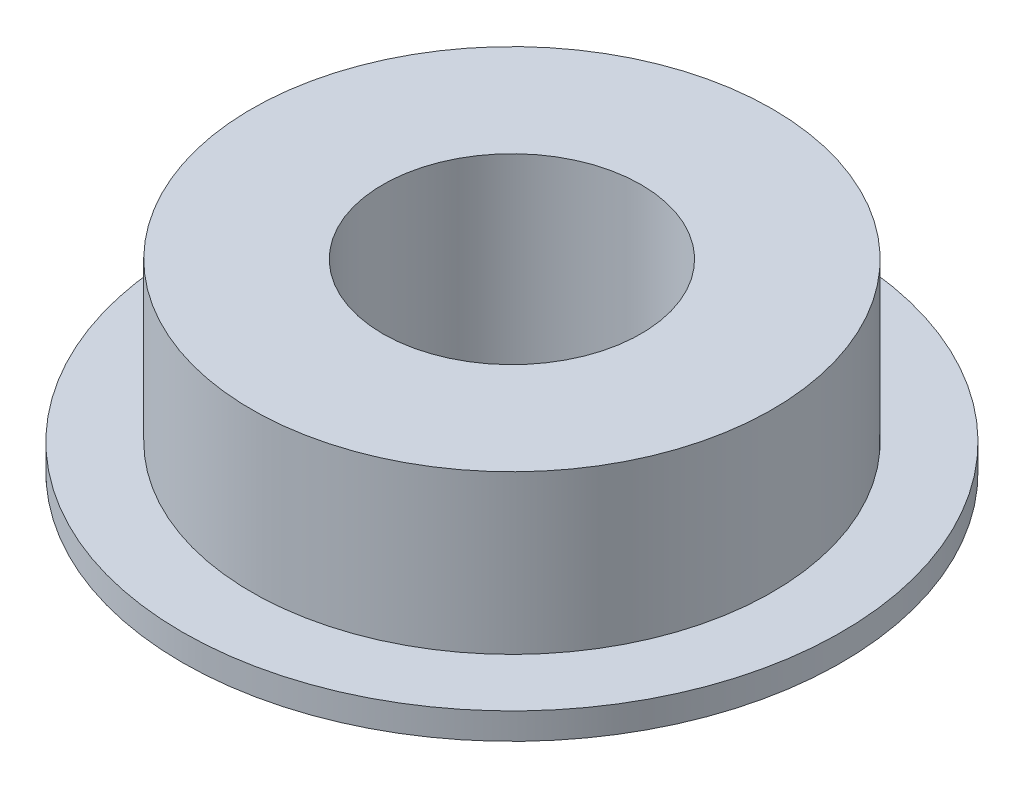
ISO-10303-21;
HEADER;
FILE_DESCRIPTION(('STEP AP214'),'2;1');
FILE_NAME('part.step','',(''),(''),'','','');
FILE_SCHEMA(('AUTOMOTIVE_DESIGN { 1 0 10303 214 1 1 1 1 }'));
ENDSEC;
DATA;
#1=APPLICATION_CONTEXT('core data for automotive mechanical design processes');
#2=APPLICATION_PROTOCOL_DEFINITION('international standard','automotive_design',2000,#1);
#3=PRODUCT_CONTEXT('',#1,'mechanical');
#4=PRODUCT('Part','Part','',(#3));
#5=PRODUCT_RELATED_PRODUCT_CATEGORY('part','',(#4));
#6=PRODUCT_DEFINITION_FORMATION('','',#4);
#7=PRODUCT_DEFINITION_CONTEXT('part definition',#1,'design');
#8=PRODUCT_DEFINITION('design','',#6,#7);
#9=PRODUCT_DEFINITION_SHAPE('','',#8);
#10=(LENGTH_UNIT() NAMED_UNIT(*) SI_UNIT(.MILLI.,.METRE.));
#11=(NAMED_UNIT(*) PLANE_ANGLE_UNIT() SI_UNIT($,.RADIAN.));
#12=(NAMED_UNIT(*) SI_UNIT($,.STERADIAN.) SOLID_ANGLE_UNIT());
#13=UNCERTAINTY_MEASURE_WITH_UNIT(LENGTH_MEASURE(1.E-05),#10,'distance_accuracy_value','');
#14=(GEOMETRIC_REPRESENTATION_CONTEXT(3) GLOBAL_UNCERTAINTY_ASSIGNED_CONTEXT((#13)) GLOBAL_UNIT_ASSIGNED_CONTEXT((#10,
#11,#12)) REPRESENTATION_CONTEXT('',''));
#15=CARTESIAN_POINT('',(0.,0.,0.));
#16=DIRECTION('',(0.,0.,1.));
#17=DIRECTION('',(1.,0.,0.));
#18=AXIS2_PLACEMENT_3D('',#15,#16,#17);
#19=CARTESIAN_POINT('',(0.,0.508,0.));
#20=DIRECTION('',(0.,1.,0.));
#21=DIRECTION('',(0.,0.,1.));
#22=AXIS2_PLACEMENT_3D('',#19,#20,#21);
#23=PLANE('',#22);
#24=CARTESIAN_POINT('',(0.,0.508,0.));
#25=DIRECTION('',(0.,1.,0.));
#26=DIRECTION('',(0.,0.,1.));
#27=AXIS2_PLACEMENT_3D('',#24,#25,#26);
#28=CIRCLE('',#27,5.0165);
#29=CARTESIAN_POINT('',(0.,0.508,-5.0165));
#30=VERTEX_POINT('',#29);
#31=EDGE_CURVE('E10',#30,#30,#28,.T.);
#32=ORIENTED_EDGE('',*,*,#31,.F.);
#33=EDGE_LOOP('',(#32));
#34=FACE_BOUND('',#33,.T.);
#35=CARTESIAN_POINT('',(0.,0.508,0.));
#36=DIRECTION('',(0.,1.,0.));
#37=DIRECTION('',(0.,0.,1.));
#38=AXIS2_PLACEMENT_3D('',#35,#36,#37);
#39=CIRCLE('',#38,6.35);
#40=CARTESIAN_POINT('',(0.,0.508,6.35));
#41=VERTEX_POINT('',#40);
#42=EDGE_CURVE('E43',#41,#41,#39,.T.);
#43=ORIENTED_EDGE('',*,*,#42,.T.);
#44=EDGE_LOOP('',(#43));
#45=FACE_BOUND('',#44,.T.);
#46=ADVANCED_FACE('F35',(#34,#45),#23,.T.);
#47=CARTESIAN_POINT('',(0.,0.,0.));
#48=DIRECTION('',(0.,1.,0.));
#49=DIRECTION('',(0.,0.,1.));
#50=AXIS2_PLACEMENT_3D('',#47,#48,#49);
#51=PLANE('',#50);
#52=CARTESIAN_POINT('',(0.,0.,0.));
#53=DIRECTION('',(0.,1.,0.));
#54=DIRECTION('',(0.,0.,1.));
#55=AXIS2_PLACEMENT_3D('',#52,#53,#54);
#56=CIRCLE('',#55,6.35);
#57=CARTESIAN_POINT('',(0.,0.,6.35));
#58=VERTEX_POINT('',#57);
#59=EDGE_CURVE('E39',#58,#58,#56,.T.);
#60=ORIENTED_EDGE('',*,*,#59,.F.);
#61=EDGE_LOOP('',(#60));
#62=FACE_BOUND('',#61,.T.);
#63=CARTESIAN_POINT('',(0.,0.,0.));
#64=DIRECTION('',(0.,1.,0.));
#65=DIRECTION('',(0.,0.,1.));
#66=AXIS2_PLACEMENT_3D('',#63,#64,#65);
#67=CIRCLE('',#66,2.4892);
#68=CARTESIAN_POINT('',(0.,0.,2.4892));
#69=VERTEX_POINT('',#68);
#70=EDGE_CURVE('E52',#69,#69,#67,.T.);
#71=ORIENTED_EDGE('',*,*,#70,.T.);
#72=EDGE_LOOP('',(#71));
#73=FACE_BOUND('',#72,.T.);
#74=ADVANCED_FACE('F79',(#62,#73),#51,.F.);
#75=CARTESIAN_POINT('',(0.,0.508,0.));
#76=DIRECTION('',(0.,-1.,0.));
#77=DIRECTION('',(0.,0.,-1.));
#78=AXIS2_PLACEMENT_3D('',#75,#76,#77);
#79=CYLINDRICAL_SURFACE('',#78,6.35);
#80=ORIENTED_EDGE('',*,*,#42,.F.);
#81=EDGE_LOOP('',(#80));
#82=FACE_BOUND('',#81,.T.);
#83=ORIENTED_EDGE('',*,*,#59,.T.);
#84=EDGE_LOOP('',(#83));
#85=FACE_BOUND('',#84,.T.);
#86=ADVANCED_FACE('F37',(#82,#85),#79,.T.);
#87=CARTESIAN_POINT('',(0.,0.508,0.));
#88=DIRECTION('',(0.,-1.,0.));
#89=DIRECTION('',(0.,0.,-1.));
#90=AXIS2_PLACEMENT_3D('',#87,#88,#89);
#91=CYLINDRICAL_SURFACE('',#90,2.4892);
#92=ORIENTED_EDGE('',*,*,#70,.F.);
#93=EDGE_LOOP('',(#92));
#94=FACE_BOUND('',#93,.T.);
#95=CARTESIAN_POINT('',(0.,3.556,0.));
#96=DIRECTION('',(0.,1.,0.));
#97=DIRECTION('',(0.,0.,1.));
#98=AXIS2_PLACEMENT_3D('',#95,#96,#97);
#99=CIRCLE('',#98,2.4892);
#100=CARTESIAN_POINT('',(0.,3.556,2.4892));
#101=VERTEX_POINT('',#100);
#102=EDGE_CURVE('E58',#101,#101,#99,.T.);
#103=ORIENTED_EDGE('',*,*,#102,.T.);
#104=EDGE_LOOP('',(#103));
#105=FACE_BOUND('',#104,.T.);
#106=ADVANCED_FACE('F64',(#94,#105),#91,.F.);
#107=CARTESIAN_POINT('',(0.,3.556,0.));
#108=DIRECTION('',(0.,1.,0.));
#109=DIRECTION('',(0.,0.,1.));
#110=AXIS2_PLACEMENT_3D('',#107,#108,#109);
#111=PLANE('',#110);
#112=CARTESIAN_POINT('',(0.,3.556,0.));
#113=DIRECTION('',(0.,1.,0.));
#114=DIRECTION('',(0.,0.,1.));
#115=AXIS2_PLACEMENT_3D('',#112,#113,#114);
#116=CIRCLE('',#115,5.0165);
#117=CARTESIAN_POINT('',(0.,3.556,-5.0165));
#118=VERTEX_POINT('',#117);
#119=EDGE_CURVE('E50',#118,#118,#116,.T.);
#120=ORIENTED_EDGE('',*,*,#119,.T.);
#121=EDGE_LOOP('',(#120));
#122=FACE_BOUND('',#121,.T.);
#123=ORIENTED_EDGE('',*,*,#102,.F.);
#124=EDGE_LOOP('',(#123));
#125=FACE_BOUND('',#124,.T.);
#126=ADVANCED_FACE('F66',(#122,#125),#111,.T.);
#127=CARTESIAN_POINT('',(0.,3.556,0.));
#128=DIRECTION('',(0.,-1.,0.));
#129=DIRECTION('',(0.,0.,-1.));
#130=AXIS2_PLACEMENT_3D('',#127,#128,#129);
#131=CYLINDRICAL_SURFACE('',#130,5.0165);
#132=CARTESIAN_POINT('',(0.,3.556,-5.0165));
#133=CARTESIAN_POINT('',(0.,3.52425,-5.0165));
#134=CARTESIAN_POINT('',(0.,3.4925,-5.0165));
#135=CARTESIAN_POINT('',(0.,3.429,-5.0165));
#136=CARTESIAN_POINT('',(0.,3.39725,-5.0165));
#137=CARTESIAN_POINT('',(0.,3.33375,-5.0165));
#138=CARTESIAN_POINT('',(0.,3.302,-5.0165));
#139=CARTESIAN_POINT('',(0.,3.2385,-5.0165));
#140=CARTESIAN_POINT('',(0.,3.20675,-5.0165));
#141=CARTESIAN_POINT('',(0.,3.14325,-5.0165));
#142=CARTESIAN_POINT('',(0.,3.1115,-5.0165));
#143=CARTESIAN_POINT('',(0.,3.048,-5.0165));
#144=CARTESIAN_POINT('',(0.,3.01625,-5.0165));
#145=CARTESIAN_POINT('',(0.,2.95275,-5.0165));
#146=CARTESIAN_POINT('',(0.,2.921,-5.0165));
#147=CARTESIAN_POINT('',(0.,2.8575,-5.0165));
#148=CARTESIAN_POINT('',(0.,2.82575,-5.0165));
#149=CARTESIAN_POINT('',(0.,2.76225,-5.0165));
#150=CARTESIAN_POINT('',(0.,2.7305,-5.0165));
#151=CARTESIAN_POINT('',(0.,2.667,-5.0165));
#152=CARTESIAN_POINT('',(0.,2.63525,-5.0165));
#153=CARTESIAN_POINT('',(0.,2.57175,-5.0165));
#154=CARTESIAN_POINT('',(0.,2.54,-5.0165));
#155=CARTESIAN_POINT('',(0.,2.4765,-5.0165));
#156=CARTESIAN_POINT('',(0.,2.44475,-5.0165));
#157=CARTESIAN_POINT('',(0.,2.38125,-5.0165));
#158=CARTESIAN_POINT('',(0.,2.3495,-5.0165));
#159=CARTESIAN_POINT('',(0.,2.286,-5.0165));
#160=CARTESIAN_POINT('',(0.,2.25425,-5.0165));
#161=CARTESIAN_POINT('',(0.,2.19075,-5.0165));
#162=CARTESIAN_POINT('',(0.,2.159,-5.0165));
#163=CARTESIAN_POINT('',(0.,2.0955,-5.0165));
#164=CARTESIAN_POINT('',(0.,2.06375,-5.0165));
#165=CARTESIAN_POINT('',(0.,2.00025,-5.0165));
#166=CARTESIAN_POINT('',(0.,1.9685,-5.0165));
#167=CARTESIAN_POINT('',(0.,1.905,-5.0165));
#168=CARTESIAN_POINT('',(0.,1.87325,-5.0165));
#169=CARTESIAN_POINT('',(0.,1.80975,-5.0165));
#170=CARTESIAN_POINT('',(0.,1.778,-5.0165));
#171=CARTESIAN_POINT('',(0.,1.7145,-5.0165));
#172=CARTESIAN_POINT('',(0.,1.68275,-5.0165));
#173=CARTESIAN_POINT('',(0.,1.61925,-5.0165));
#174=CARTESIAN_POINT('',(0.,1.5875,-5.0165));
#175=CARTESIAN_POINT('',(0.,1.524,-5.0165));
#176=CARTESIAN_POINT('',(0.,1.49225,-5.0165));
#177=CARTESIAN_POINT('',(0.,1.42875,-5.0165));
#178=CARTESIAN_POINT('',(0.,1.397,-5.0165));
#179=CARTESIAN_POINT('',(0.,1.3335,-5.0165));
#180=CARTESIAN_POINT('',(0.,1.30175,-5.0165));
#181=CARTESIAN_POINT('',(0.,1.23825,-5.0165));
#182=CARTESIAN_POINT('',(0.,1.2065,-5.0165));
#183=CARTESIAN_POINT('',(0.,1.143,-5.0165));
#184=CARTESIAN_POINT('',(0.,1.11125,-5.0165));
#185=CARTESIAN_POINT('',(0.,1.04775,-5.0165));
#186=CARTESIAN_POINT('',(0.,1.016,-5.0165));
#187=CARTESIAN_POINT('',(0.,0.9525,-5.0165));
#188=CARTESIAN_POINT('',(0.,0.92075,-5.0165));
#189=CARTESIAN_POINT('',(0.,0.85725,-5.0165));
#190=CARTESIAN_POINT('',(0.,0.8255,-5.0165));
#191=CARTESIAN_POINT('',(0.,0.762,-5.0165));
#192=CARTESIAN_POINT('',(0.,0.73025,-5.0165));
#193=CARTESIAN_POINT('',(0.,0.66675,-5.0165));
#194=CARTESIAN_POINT('',(0.,0.635,-5.0165));
#195=CARTESIAN_POINT('',(0.,0.5715,-5.0165));
#196=CARTESIAN_POINT('',(0.,0.53975,-5.0165));
#197=CARTESIAN_POINT('',(0.,0.508,-5.0165));
#198=B_SPLINE_CURVE_WITH_KNOTS('',3,(#132,#133,#134,#135,#136,#137,#138,#139,#140,#141,#142,
#143,#144,#145,#146,#147,#148,#149,#150,#151,#152,#153,#154,#155,#156,#157,#158,#159,#160,#161,
#162,#163,#164,#165,#166,#167,#168,#169,#170,#171,#172,#173,#174,#175,#176,#177,#178,#179,#180,
#181,#182,#183,#184,#185,#186,#187,#188,#189,#190,#191,#192,#193,#194,#195,#196,#197),
.UNSPECIFIED.,.F.,.F.,(4,2,2,2,2,2,2,2,2,2,2,2,2,2,2,2,2,2,2,2,2,2,2,2,2,2,2,2,2,2,2,2,4),(0.,
0.0952499999999998,0.1905,0.28575,0.381,0.47625,0.5715,0.66675,0.762,0.85725,0.9525,1.04775,
1.143,1.23825,1.3335,1.42875,1.524,1.61925,1.7145,1.80975,1.905,2.00025,2.0955,2.19075,2.286,
2.38125,2.4765,2.57175,2.667,2.76225,2.8575,2.95275,3.048),.UNSPECIFIED.);
#199=EDGE_CURVE('BSEAM68',#118,#30,#198,.T.);
#200=ORIENTED_EDGE('',*,*,#119,.F.);
#201=ORIENTED_EDGE('',*,*,#31,.T.);
#202=ORIENTED_EDGE('',*,*,#199,.T.);
#203=ORIENTED_EDGE('',*,*,#199,.F.);
#204=EDGE_LOOP('',(#200,#202,#201,#203));
#205=FACE_BOUND('',#204,.T.);
#206=ADVANCED_FACE('F68',(#205),#131,.T.);
#207=CLOSED_SHELL('',(#46,#74,#86,#106,#126,#206));
#208=MANIFOLD_SOLID_BREP('B2',#207);
#209=ADVANCED_BREP_SHAPE_REPRESENTATION('',(#18,#208),#14);
#210=SHAPE_DEFINITION_REPRESENTATION(#9,#209);
ENDSEC;
END-ISO-10303-21;
